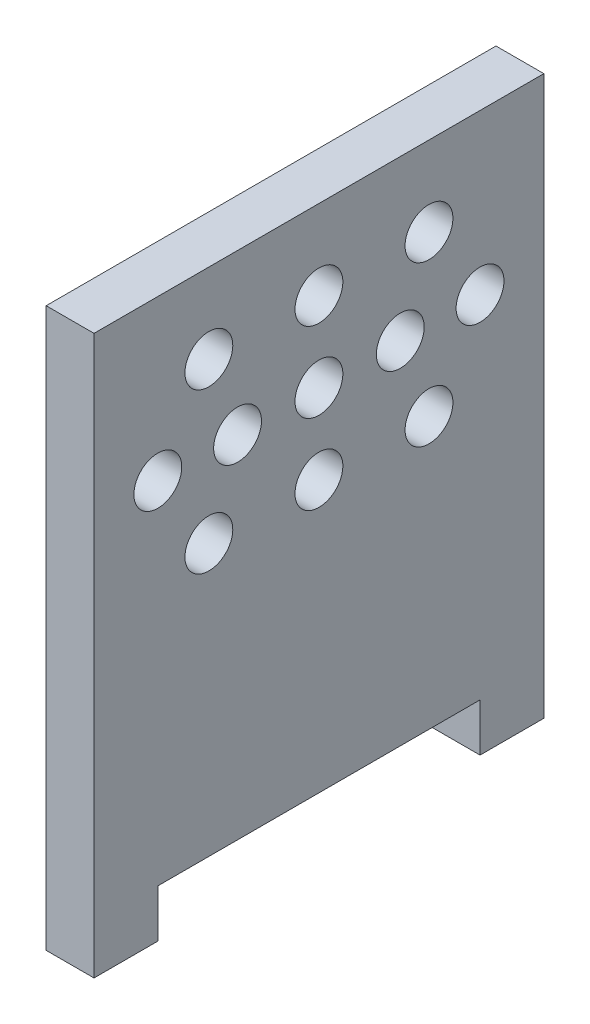
ISO-10303-21;
HEADER;
FILE_DESCRIPTION(('STEP AP214'),'2;1');
FILE_NAME('part.step','',(''),(''),'','','');
FILE_SCHEMA(('AUTOMOTIVE_DESIGN { 1 0 10303 214 1 1 1 1 }'));
ENDSEC;
DATA;
#1=APPLICATION_CONTEXT('core data for automotive mechanical design processes');
#2=APPLICATION_PROTOCOL_DEFINITION('international standard','automotive_design',2000,#1);
#3=PRODUCT_CONTEXT('',#1,'mechanical');
#4=PRODUCT('Part','Part','',(#3));
#5=PRODUCT_RELATED_PRODUCT_CATEGORY('part','',(#4));
#6=PRODUCT_DEFINITION_FORMATION('','',#4);
#7=PRODUCT_DEFINITION_CONTEXT('part definition',#1,'design');
#8=PRODUCT_DEFINITION('design','',#6,#7);
#9=PRODUCT_DEFINITION_SHAPE('','',#8);
#10=(LENGTH_UNIT() NAMED_UNIT(*) SI_UNIT(.MILLI.,.METRE.));
#11=(NAMED_UNIT(*) PLANE_ANGLE_UNIT() SI_UNIT($,.RADIAN.));
#12=(NAMED_UNIT(*) SI_UNIT($,.STERADIAN.) SOLID_ANGLE_UNIT());
#13=UNCERTAINTY_MEASURE_WITH_UNIT(LENGTH_MEASURE(1.E-05),#10,'distance_accuracy_value','');
#14=(GEOMETRIC_REPRESENTATION_CONTEXT(3) GLOBAL_UNCERTAINTY_ASSIGNED_CONTEXT((#13)) GLOBAL_UNIT_ASSIGNED_CONTEXT((#10,
#11,#12)) REPRESENTATION_CONTEXT('',''));
#15=CARTESIAN_POINT('',(0.,0.,0.));
#16=DIRECTION('',(0.,0.,1.));
#17=DIRECTION('',(1.,0.,0.));
#18=AXIS2_PLACEMENT_3D('',#15,#16,#17);
#19=CARTESIAN_POINT('',(0.,-35.,23.2));
#20=DIRECTION('',(0.,-1.,0.));
#21=DIRECTION('',(1.,0.,0.));
#22=AXIS2_PLACEMENT_3D('',#19,#20,#21);
#23=PLANE('',#22);
#24=DIRECTION('',(0.,0.,1.));
#25=VECTOR('',#24,1.);
#26=CARTESIAN_POINT('',(-3.,-35.,23.2));
#27=LINE('',#26,#25);
#28=CARTESIAN_POINT('',(-3.,-35.,23.2));
#29=VERTEX_POINT('',#28);
#30=CARTESIAN_POINT('',(-3.,-35.,27.2));
#31=VERTEX_POINT('',#30);
#32=EDGE_CURVE('E130',#29,#31,#27,.T.);
#33=ORIENTED_EDGE('',*,*,#32,.F.);
#34=DIRECTION('',(-1.,0.,0.));
#35=VECTOR('',#34,1.);
#36=CARTESIAN_POINT('',(0.,-35.,23.2));
#37=LINE('',#36,#35);
#38=CARTESIAN_POINT('',(0.,-35.,23.2));
#39=VERTEX_POINT('',#38);
#40=EDGE_CURVE('E11',#39,#29,#37,.T.);
#41=ORIENTED_EDGE('',*,*,#40,.F.);
#42=DIRECTION('',(0.,0.,1.));
#43=VECTOR('',#42,1.);
#44=CARTESIAN_POINT('',(0.,-35.,23.2));
#45=LINE('',#44,#43);
#46=CARTESIAN_POINT('',(0.,-35.,27.2));
#47=VERTEX_POINT('',#46);
#48=EDGE_CURVE('E151',#39,#47,#45,.T.);
#49=ORIENTED_EDGE('',*,*,#48,.T.);
#50=DIRECTION('',(-1.,0.,0.));
#51=VECTOR('',#50,1.);
#52=CARTESIAN_POINT('',(0.,-35.,27.2));
#53=LINE('',#52,#51);
#54=EDGE_CURVE('E36',#47,#31,#53,.T.);
#55=ORIENTED_EDGE('',*,*,#54,.T.);
#56=EDGE_LOOP('',(#33,#41,#49,#55));
#57=FACE_BOUND('',#56,.T.);
#58=ADVANCED_FACE('F33',(#57),#23,.T.);
#59=CARTESIAN_POINT('',(0.,-32.,23.2));
#60=DIRECTION('',(0.,0.,-1.));
#61=DIRECTION('',(-1.,0.,0.));
#62=AXIS2_PLACEMENT_3D('',#59,#60,#61);
#63=PLANE('',#62);
#64=DIRECTION('',(0.,-1.,0.));
#65=VECTOR('',#64,1.);
#66=CARTESIAN_POINT('',(-3.,-32.,23.2));
#67=LINE('',#66,#65);
#68=CARTESIAN_POINT('',(-3.,-32.,23.2));
#69=VERTEX_POINT('',#68);
#70=EDGE_CURVE('E149',#69,#29,#67,.T.);
#71=ORIENTED_EDGE('',*,*,#70,.F.);
#72=DIRECTION('',(-1.,0.,0.));
#73=VECTOR('',#72,1.);
#74=CARTESIAN_POINT('',(0.,-32.,23.2));
#75=LINE('',#74,#73);
#76=CARTESIAN_POINT('',(0.,-32.,23.2));
#77=VERTEX_POINT('',#76);
#78=EDGE_CURVE('E42',#77,#69,#75,.T.);
#79=ORIENTED_EDGE('',*,*,#78,.F.);
#80=DIRECTION('',(0.,-1.,0.));
#81=VECTOR('',#80,1.);
#82=CARTESIAN_POINT('',(0.,-32.,23.2));
#83=LINE('',#82,#81);
#84=EDGE_CURVE('E120',#77,#39,#83,.T.);
#85=ORIENTED_EDGE('',*,*,#84,.T.);
#86=ORIENTED_EDGE('',*,*,#40,.T.);
#87=EDGE_LOOP('',(#71,#79,#85,#86));
#88=FACE_BOUND('',#87,.T.);
#89=ADVANCED_FACE('F163',(#88),#63,.T.);
#90=CARTESIAN_POINT('',(0.,-32.,2.99999999999999));
#91=DIRECTION('',(0.,-1.,0.));
#92=DIRECTION('',(0.,0.,-1.));
#93=AXIS2_PLACEMENT_3D('',#90,#91,#92);
#94=PLANE('',#93);
#95=DIRECTION('',(0.,0.,1.));
#96=VECTOR('',#95,1.);
#97=CARTESIAN_POINT('',(-3.,-32.,2.99999999999999));
#98=LINE('',#97,#96);
#99=CARTESIAN_POINT('',(-3.,-32.,2.99999999999999));
#100=VERTEX_POINT('',#99);
#101=EDGE_CURVE('E107',#100,#69,#98,.T.);
#102=ORIENTED_EDGE('',*,*,#101,.F.);
#103=DIRECTION('',(-1.,0.,0.));
#104=VECTOR('',#103,1.);
#105=CARTESIAN_POINT('',(0.,-32.,2.99999999999999));
#106=LINE('',#105,#104);
#107=CARTESIAN_POINT('',(0.,-32.,2.99999999999999));
#108=VERTEX_POINT('',#107);
#109=EDGE_CURVE('E102',#108,#100,#106,.T.);
#110=ORIENTED_EDGE('',*,*,#109,.F.);
#111=DIRECTION('',(0.,0.,1.));
#112=VECTOR('',#111,1.);
#113=CARTESIAN_POINT('',(0.,-32.,2.99999999999999));
#114=LINE('',#113,#112);
#115=EDGE_CURVE('E105',#108,#77,#114,.T.);
#116=ORIENTED_EDGE('',*,*,#115,.T.);
#117=ORIENTED_EDGE('',*,*,#78,.T.);
#118=EDGE_LOOP('',(#102,#110,#116,#117));
#119=FACE_BOUND('',#118,.T.);
#120=ADVANCED_FACE('F104',(#119),#94,.T.);
#121=CARTESIAN_POINT('',(0.,-35.,3.));
#122=DIRECTION('',(0.,0.,1.));
#123=DIRECTION('',(0.,-1.,0.));
#124=AXIS2_PLACEMENT_3D('',#121,#122,#123);
#125=PLANE('',#124);
#126=DIRECTION('',(0.,1.,0.));
#127=VECTOR('',#126,1.);
#128=CARTESIAN_POINT('',(-3.,-35.,3.));
#129=LINE('',#128,#127);
#130=CARTESIAN_POINT('',(-3.,-35.,3.));
#131=VERTEX_POINT('',#130);
#132=EDGE_CURVE('E146',#131,#100,#129,.T.);
#133=ORIENTED_EDGE('',*,*,#132,.F.);
#134=DIRECTION('',(-1.,0.,0.));
#135=VECTOR('',#134,1.);
#136=CARTESIAN_POINT('',(0.,-35.,3.));
#137=LINE('',#136,#135);
#138=CARTESIAN_POINT('',(0.,-35.,3.));
#139=VERTEX_POINT('',#138);
#140=EDGE_CURVE('E112',#139,#131,#137,.T.);
#141=ORIENTED_EDGE('',*,*,#140,.F.);
#142=DIRECTION('',(0.,1.,0.));
#143=VECTOR('',#142,1.);
#144=CARTESIAN_POINT('',(0.,-35.,3.));
#145=LINE('',#144,#143);
#146=EDGE_CURVE('E118',#139,#108,#145,.T.);
#147=ORIENTED_EDGE('',*,*,#146,.T.);
#148=ORIENTED_EDGE('',*,*,#109,.T.);
#149=EDGE_LOOP('',(#133,#141,#147,#148));
#150=FACE_BOUND('',#149,.T.);
#151=ADVANCED_FACE('F122',(#150),#125,.T.);
#152=CARTESIAN_POINT('',(0.,-35.,-1.00000000000001));
#153=DIRECTION('',(0.,-1.,0.));
#154=DIRECTION('',(0.,0.,-1.));
#155=AXIS2_PLACEMENT_3D('',#152,#153,#154);
#156=PLANE('',#155);
#157=DIRECTION('',(0.,0.,1.));
#158=VECTOR('',#157,1.);
#159=CARTESIAN_POINT('',(-3.,-35.,-1.00000000000001));
#160=LINE('',#159,#158);
#161=CARTESIAN_POINT('',(-3.,-35.,-1.00000000000001));
#162=VERTEX_POINT('',#161);
#163=EDGE_CURVE('E143',#162,#131,#160,.T.);
#164=ORIENTED_EDGE('',*,*,#163,.F.);
#165=DIRECTION('',(-1.,0.,0.));
#166=VECTOR('',#165,1.);
#167=CARTESIAN_POINT('',(0.,-35.,-1.00000000000001));
#168=LINE('',#167,#166);
#169=CARTESIAN_POINT('',(0.,-35.,-1.00000000000001));
#170=VERTEX_POINT('',#169);
#171=EDGE_CURVE('E155',#170,#162,#168,.T.);
#172=ORIENTED_EDGE('',*,*,#171,.F.);
#173=DIRECTION('',(0.,0.,1.));
#174=VECTOR('',#173,1.);
#175=CARTESIAN_POINT('',(0.,-35.,-1.00000000000001));
#176=LINE('',#175,#174);
#177=EDGE_CURVE('E123',#170,#139,#176,.T.);
#178=ORIENTED_EDGE('',*,*,#177,.T.);
#179=ORIENTED_EDGE('',*,*,#140,.T.);
#180=EDGE_LOOP('',(#164,#172,#178,#179));
#181=FACE_BOUND('',#180,.T.);
#182=ADVANCED_FACE('F176',(#181),#156,.T.);
#183=CARTESIAN_POINT('',(0.,0.,-1.00000000000001));
#184=DIRECTION('',(0.,0.,-1.));
#185=DIRECTION('',(-1.,0.,0.));
#186=AXIS2_PLACEMENT_3D('',#183,#184,#185);
#187=PLANE('',#186);
#188=DIRECTION('',(0.,-1.,0.));
#189=VECTOR('',#188,1.);
#190=CARTESIAN_POINT('',(-3.,0.,-1.00000000000001));
#191=LINE('',#190,#189);
#192=CARTESIAN_POINT('',(-3.,0.,-1.00000000000001));
#193=VERTEX_POINT('',#192);
#194=EDGE_CURVE('E140',#193,#162,#191,.T.);
#195=ORIENTED_EDGE('',*,*,#194,.F.);
#196=DIRECTION('',(-1.,0.,0.));
#197=VECTOR('',#196,1.);
#198=CARTESIAN_POINT('',(0.,0.,-1.00000000000001));
#199=LINE('',#198,#197);
#200=CARTESIAN_POINT('',(0.,0.,-1.00000000000001));
#201=VERTEX_POINT('',#200);
#202=EDGE_CURVE('E157',#201,#193,#199,.T.);
#203=ORIENTED_EDGE('',*,*,#202,.F.);
#204=DIRECTION('',(0.,-1.,0.));
#205=VECTOR('',#204,1.);
#206=CARTESIAN_POINT('',(0.,0.,-1.00000000000001));
#207=LINE('',#206,#205);
#208=EDGE_CURVE('E125',#201,#170,#207,.T.);
#209=ORIENTED_EDGE('',*,*,#208,.T.);
#210=ORIENTED_EDGE('',*,*,#171,.T.);
#211=EDGE_LOOP('',(#195,#203,#209,#210));
#212=FACE_BOUND('',#211,.T.);
#213=ADVANCED_FACE('F179',(#212),#187,.T.);
#214=CARTESIAN_POINT('',(0.,0.,27.2));
#215=DIRECTION('',(0.,1.,0.));
#216=DIRECTION('',(0.,0.,1.));
#217=AXIS2_PLACEMENT_3D('',#214,#215,#216);
#218=PLANE('',#217);
#219=DIRECTION('',(0.,0.,-1.));
#220=VECTOR('',#219,1.);
#221=CARTESIAN_POINT('',(-3.,0.,27.2));
#222=LINE('',#221,#220);
#223=CARTESIAN_POINT('',(-3.,0.,27.2));
#224=VERTEX_POINT('',#223);
#225=EDGE_CURVE('E137',#224,#193,#222,.T.);
#226=ORIENTED_EDGE('',*,*,#225,.F.);
#227=DIRECTION('',(-1.,0.,0.));
#228=VECTOR('',#227,1.);
#229=CARTESIAN_POINT('',(0.,0.,27.2));
#230=LINE('',#229,#228);
#231=CARTESIAN_POINT('',(0.,0.,27.2));
#232=VERTEX_POINT('',#231);
#233=EDGE_CURVE('E158',#232,#224,#230,.T.);
#234=ORIENTED_EDGE('',*,*,#233,.F.);
#235=DIRECTION('',(0.,0.,-1.));
#236=VECTOR('',#235,1.);
#237=CARTESIAN_POINT('',(0.,0.,27.2));
#238=LINE('',#237,#236);
#239=EDGE_CURVE('E315',#232,#201,#238,.T.);
#240=ORIENTED_EDGE('',*,*,#239,.T.);
#241=ORIENTED_EDGE('',*,*,#202,.T.);
#242=EDGE_LOOP('',(#226,#234,#240,#241));
#243=FACE_BOUND('',#242,.T.);
#244=ADVANCED_FACE('F183',(#243),#218,.T.);
#245=CARTESIAN_POINT('',(0.,-35.,27.2));
#246=DIRECTION('',(0.,0.,1.));
#247=DIRECTION('',(0.,-1.,0.));
#248=AXIS2_PLACEMENT_3D('',#245,#246,#247);
#249=PLANE('',#248);
#250=DIRECTION('',(0.,1.,0.));
#251=VECTOR('',#250,1.);
#252=CARTESIAN_POINT('',(-3.,-35.,27.2));
#253=LINE('',#252,#251);
#254=EDGE_CURVE('E133',#31,#224,#253,.T.);
#255=ORIENTED_EDGE('',*,*,#254,.F.);
#256=ORIENTED_EDGE('',*,*,#54,.F.);
#257=DIRECTION('',(0.,1.,0.));
#258=VECTOR('',#257,1.);
#259=CARTESIAN_POINT('',(0.,-35.,27.2));
#260=LINE('',#259,#258);
#261=EDGE_CURVE('E313',#47,#232,#260,.T.);
#262=ORIENTED_EDGE('',*,*,#261,.T.);
#263=ORIENTED_EDGE('',*,*,#233,.T.);
#264=EDGE_LOOP('',(#255,#256,#262,#263));
#265=FACE_BOUND('',#264,.T.);
#266=ADVANCED_FACE('F160',(#265),#249,.T.);
#267=CARTESIAN_POINT('',(0.,0.,0.));
#268=DIRECTION('',(-1.,0.,0.));
#269=DIRECTION('',(0.,-1.,0.));
#270=AXIS2_PLACEMENT_3D('',#267,#268,#269);
#271=PLANE('',#270);
#272=CARTESIAN_POINT('',(0.,-9.99998284033426,18.1999999999711));
#273=DIRECTION('',(-1.,0.,0.));
#274=DIRECTION('',(0.,1.,0.));
#275=AXIS2_PLACEMENT_3D('',#272,#273,#274);
#276=CIRCLE('',#275,1.50000000000828);
#277=CARTESIAN_POINT('',(0.,-8.49998284032598,18.1999999999711));
#278=VERTEX_POINT('',#277);
#279=EDGE_CURVE('E246',#278,#278,#276,.T.);
#280=ORIENTED_EDGE('',*,*,#279,.T.);
#281=EDGE_LOOP('',(#280));
#282=FACE_BOUND('',#281,.T.);
#283=CARTESIAN_POINT('',(0.,-9.99998284033426,23.2));
#284=DIRECTION('',(-1.,0.,0.));
#285=DIRECTION('',(0.,1.,0.));
#286=AXIS2_PLACEMENT_3D('',#283,#284,#285);
#287=CIRCLE('',#286,1.5);
#288=CARTESIAN_POINT('',(0.,-8.49998284033425,23.2));
#289=VERTEX_POINT('',#288);
#290=EDGE_CURVE('E254',#289,#289,#287,.T.);
#291=ORIENTED_EDGE('',*,*,#290,.T.);
#292=EDGE_LOOP('',(#291));
#293=FACE_BOUND('',#292,.T.);
#294=CARTESIAN_POINT('',(0.,-15.,13.1));
#295=DIRECTION('',(-1.,0.,0.));
#296=DIRECTION('',(0.,1.,0.));
#297=AXIS2_PLACEMENT_3D('',#294,#295,#296);
#298=CIRCLE('',#297,1.5);
#299=CARTESIAN_POINT('',(0.,-13.5,13.1));
#300=VERTEX_POINT('',#299);
#301=EDGE_CURVE('E260',#300,#300,#298,.T.);
#302=ORIENTED_EDGE('',*,*,#301,.T.);
#303=EDGE_LOOP('',(#302));
#304=FACE_BOUND('',#303,.T.);
#305=CARTESIAN_POINT('',(0.,-5.,13.1));
#306=DIRECTION('',(-1.,0.,0.));
#307=DIRECTION('',(0.,1.,0.));
#308=AXIS2_PLACEMENT_3D('',#305,#306,#307);
#309=CIRCLE('',#308,1.5);
#310=CARTESIAN_POINT('',(0.,-3.5,13.1));
#311=VERTEX_POINT('',#310);
#312=EDGE_CURVE('E266',#311,#311,#309,.T.);
#313=ORIENTED_EDGE('',*,*,#312,.T.);
#314=EDGE_LOOP('',(#313));
#315=FACE_BOUND('',#314,.T.);
#316=CARTESIAN_POINT('',(0.,-10.,2.99999999999999));
#317=DIRECTION('',(-1.,0.,0.));
#318=DIRECTION('',(0.,1.,0.));
#319=AXIS2_PLACEMENT_3D('',#316,#317,#318);
#320=CIRCLE('',#319,1.5);
#321=CARTESIAN_POINT('',(0.,-8.5,2.99999999999999));
#322=VERTEX_POINT('',#321);
#323=EDGE_CURVE('E272',#322,#322,#320,.T.);
#324=ORIENTED_EDGE('',*,*,#323,.T.);
#325=EDGE_LOOP('',(#324));
#326=FACE_BOUND('',#325,.T.);
#327=CARTESIAN_POINT('',(0.,-10.,13.1));
#328=DIRECTION('',(-1.,0.,0.));
#329=DIRECTION('',(0.,1.,0.));
#330=AXIS2_PLACEMENT_3D('',#327,#328,#329);
#331=CIRCLE('',#330,1.5);
#332=CARTESIAN_POINT('',(0.,-8.5,13.1));
#333=VERTEX_POINT('',#332);
#334=EDGE_CURVE('E278',#333,#333,#331,.T.);
#335=ORIENTED_EDGE('',*,*,#334,.T.);
#336=EDGE_LOOP('',(#335));
#337=FACE_BOUND('',#336,.T.);
#338=CARTESIAN_POINT('',(0.,-15.,6.2));
#339=DIRECTION('',(-1.,0.,0.));
#340=DIRECTION('',(0.,1.,0.));
#341=AXIS2_PLACEMENT_3D('',#338,#339,#340);
#342=CIRCLE('',#341,1.5);
#343=CARTESIAN_POINT('',(0.,-13.5,6.2));
#344=VERTEX_POINT('',#343);
#345=EDGE_CURVE('E284',#344,#344,#342,.T.);
#346=ORIENTED_EDGE('',*,*,#345,.T.);
#347=EDGE_LOOP('',(#346));
#348=FACE_BOUND('',#347,.T.);
#349=CARTESIAN_POINT('',(0.,-5.,20.));
#350=DIRECTION('',(-1.,0.,0.));
#351=DIRECTION('',(0.,1.,0.));
#352=AXIS2_PLACEMENT_3D('',#349,#350,#351);
#353=CIRCLE('',#352,1.5);
#354=CARTESIAN_POINT('',(0.,-3.5,20.));
#355=VERTEX_POINT('',#354);
#356=EDGE_CURVE('E290',#355,#355,#353,.T.);
#357=ORIENTED_EDGE('',*,*,#356,.T.);
#358=EDGE_LOOP('',(#357));
#359=FACE_BOUND('',#358,.T.);
#360=CARTESIAN_POINT('',(0.,-15.,20.));
#361=DIRECTION('',(-1.,0.,0.));
#362=DIRECTION('',(0.,1.,0.));
#363=AXIS2_PLACEMENT_3D('',#360,#361,#362);
#364=CIRCLE('',#363,1.5);
#365=CARTESIAN_POINT('',(0.,-13.5,20.));
#366=VERTEX_POINT('',#365);
#367=EDGE_CURVE('E296',#366,#366,#364,.T.);
#368=ORIENTED_EDGE('',*,*,#367,.T.);
#369=EDGE_LOOP('',(#368));
#370=FACE_BOUND('',#369,.T.);
#371=CARTESIAN_POINT('',(0.,-10.,7.99999999999999));
#372=DIRECTION('',(-1.,0.,0.));
#373=DIRECTION('',(0.,1.,0.));
#374=AXIS2_PLACEMENT_3D('',#371,#372,#373);
#375=CIRCLE('',#374,1.5);
#376=CARTESIAN_POINT('',(0.,-8.5,7.99999999999999));
#377=VERTEX_POINT('',#376);
#378=EDGE_CURVE('E302',#377,#377,#375,.T.);
#379=ORIENTED_EDGE('',*,*,#378,.T.);
#380=EDGE_LOOP('',(#379));
#381=FACE_BOUND('',#380,.T.);
#382=CARTESIAN_POINT('',(0.,-5.,6.2));
#383=DIRECTION('',(-1.,0.,0.));
#384=DIRECTION('',(0.,1.,0.));
#385=AXIS2_PLACEMENT_3D('',#382,#383,#384);
#386=CIRCLE('',#385,1.5);
#387=CARTESIAN_POINT('',(0.,-3.5,6.2));
#388=VERTEX_POINT('',#387);
#389=EDGE_CURVE('E134',#388,#388,#386,.T.);
#390=ORIENTED_EDGE('',*,*,#389,.T.);
#391=EDGE_LOOP('',(#390));
#392=FACE_BOUND('',#391,.T.);
#393=ORIENTED_EDGE('',*,*,#48,.F.);
#394=ORIENTED_EDGE('',*,*,#84,.F.);
#395=ORIENTED_EDGE('',*,*,#115,.F.);
#396=ORIENTED_EDGE('',*,*,#146,.F.);
#397=ORIENTED_EDGE('',*,*,#177,.F.);
#398=ORIENTED_EDGE('',*,*,#208,.F.);
#399=ORIENTED_EDGE('',*,*,#239,.F.);
#400=ORIENTED_EDGE('',*,*,#261,.F.);
#401=EDGE_LOOP('',(#393,#394,#395,#396,#397,#398,#399,#400));
#402=FACE_BOUND('',#401,.T.);
#403=ADVANCED_FACE('F116',(#282,#293,#304,#315,#326,#337,#348,#359,#370,#381,#392,#402),#271,.F.);
#404=CARTESIAN_POINT('',(-3.,0.,0.));
#405=DIRECTION('',(-1.,0.,0.));
#406=DIRECTION('',(0.,-1.,0.));
#407=AXIS2_PLACEMENT_3D('',#404,#405,#406);
#408=PLANE('',#407);
#409=CARTESIAN_POINT('',(-3.,-9.99998284033426,18.1999999999711));
#410=DIRECTION('',(-1.,0.,0.));
#411=DIRECTION('',(0.,1.,0.));
#412=AXIS2_PLACEMENT_3D('',#409,#410,#411);
#413=CIRCLE('',#412,1.50000000000828);
#414=CARTESIAN_POINT('',(-3.,-8.49998284032598,18.1999999999711));
#415=VERTEX_POINT('',#414);
#416=EDGE_CURVE('E249',#415,#415,#413,.T.);
#417=ORIENTED_EDGE('',*,*,#416,.F.);
#418=EDGE_LOOP('',(#417));
#419=FACE_BOUND('',#418,.T.);
#420=CARTESIAN_POINT('',(-3.,-9.99998284033426,23.2));
#421=DIRECTION('',(-1.,0.,0.));
#422=DIRECTION('',(0.,1.,0.));
#423=AXIS2_PLACEMENT_3D('',#420,#421,#422);
#424=CIRCLE('',#423,1.5);
#425=CARTESIAN_POINT('',(-3.,-8.49998284033425,23.2));
#426=VERTEX_POINT('',#425);
#427=EDGE_CURVE('E251',#426,#426,#424,.T.);
#428=ORIENTED_EDGE('',*,*,#427,.F.);
#429=EDGE_LOOP('',(#428));
#430=FACE_BOUND('',#429,.T.);
#431=CARTESIAN_POINT('',(-3.,-15.,13.1));
#432=DIRECTION('',(-1.,0.,0.));
#433=DIRECTION('',(0.,1.,0.));
#434=AXIS2_PLACEMENT_3D('',#431,#432,#433);
#435=CIRCLE('',#434,1.5);
#436=CARTESIAN_POINT('',(-3.,-13.5,13.1));
#437=VERTEX_POINT('',#436);
#438=EDGE_CURVE('E257',#437,#437,#435,.T.);
#439=ORIENTED_EDGE('',*,*,#438,.F.);
#440=EDGE_LOOP('',(#439));
#441=FACE_BOUND('',#440,.T.);
#442=CARTESIAN_POINT('',(-3.,-5.,13.1));
#443=DIRECTION('',(-1.,0.,0.));
#444=DIRECTION('',(0.,1.,0.));
#445=AXIS2_PLACEMENT_3D('',#442,#443,#444);
#446=CIRCLE('',#445,1.5);
#447=CARTESIAN_POINT('',(-3.,-3.5,13.1));
#448=VERTEX_POINT('',#447);
#449=EDGE_CURVE('E263',#448,#448,#446,.T.);
#450=ORIENTED_EDGE('',*,*,#449,.F.);
#451=EDGE_LOOP('',(#450));
#452=FACE_BOUND('',#451,.T.);
#453=CARTESIAN_POINT('',(-3.,-10.,2.99999999999999));
#454=DIRECTION('',(-1.,0.,0.));
#455=DIRECTION('',(0.,1.,0.));
#456=AXIS2_PLACEMENT_3D('',#453,#454,#455);
#457=CIRCLE('',#456,1.5);
#458=CARTESIAN_POINT('',(-3.,-8.5,2.99999999999999));
#459=VERTEX_POINT('',#458);
#460=EDGE_CURVE('E269',#459,#459,#457,.T.);
#461=ORIENTED_EDGE('',*,*,#460,.F.);
#462=EDGE_LOOP('',(#461));
#463=FACE_BOUND('',#462,.T.);
#464=CARTESIAN_POINT('',(-3.,-10.,13.1));
#465=DIRECTION('',(-1.,0.,0.));
#466=DIRECTION('',(0.,1.,0.));
#467=AXIS2_PLACEMENT_3D('',#464,#465,#466);
#468=CIRCLE('',#467,1.5);
#469=CARTESIAN_POINT('',(-3.,-8.5,13.1));
#470=VERTEX_POINT('',#469);
#471=EDGE_CURVE('E275',#470,#470,#468,.T.);
#472=ORIENTED_EDGE('',*,*,#471,.F.);
#473=EDGE_LOOP('',(#472));
#474=FACE_BOUND('',#473,.T.);
#475=CARTESIAN_POINT('',(-3.,-15.,6.2));
#476=DIRECTION('',(-1.,0.,0.));
#477=DIRECTION('',(0.,1.,0.));
#478=AXIS2_PLACEMENT_3D('',#475,#476,#477);
#479=CIRCLE('',#478,1.5);
#480=CARTESIAN_POINT('',(-3.,-13.5,6.2));
#481=VERTEX_POINT('',#480);
#482=EDGE_CURVE('E281',#481,#481,#479,.T.);
#483=ORIENTED_EDGE('',*,*,#482,.F.);
#484=EDGE_LOOP('',(#483));
#485=FACE_BOUND('',#484,.T.);
#486=CARTESIAN_POINT('',(-3.,-5.,20.));
#487=DIRECTION('',(-1.,0.,0.));
#488=DIRECTION('',(0.,1.,0.));
#489=AXIS2_PLACEMENT_3D('',#486,#487,#488);
#490=CIRCLE('',#489,1.5);
#491=CARTESIAN_POINT('',(-3.,-3.5,20.));
#492=VERTEX_POINT('',#491);
#493=EDGE_CURVE('E287',#492,#492,#490,.T.);
#494=ORIENTED_EDGE('',*,*,#493,.F.);
#495=EDGE_LOOP('',(#494));
#496=FACE_BOUND('',#495,.T.);
#497=CARTESIAN_POINT('',(-3.,-15.,20.));
#498=DIRECTION('',(-1.,0.,0.));
#499=DIRECTION('',(0.,1.,0.));
#500=AXIS2_PLACEMENT_3D('',#497,#498,#499);
#501=CIRCLE('',#500,1.5);
#502=CARTESIAN_POINT('',(-3.,-13.5,20.));
#503=VERTEX_POINT('',#502);
#504=EDGE_CURVE('E293',#503,#503,#501,.T.);
#505=ORIENTED_EDGE('',*,*,#504,.F.);
#506=EDGE_LOOP('',(#505));
#507=FACE_BOUND('',#506,.T.);
#508=CARTESIAN_POINT('',(-3.,-10.,7.99999999999999));
#509=DIRECTION('',(-1.,0.,0.));
#510=DIRECTION('',(0.,1.,0.));
#511=AXIS2_PLACEMENT_3D('',#508,#509,#510);
#512=CIRCLE('',#511,1.5);
#513=CARTESIAN_POINT('',(-3.,-8.5,7.99999999999999));
#514=VERTEX_POINT('',#513);
#515=EDGE_CURVE('E299',#514,#514,#512,.T.);
#516=ORIENTED_EDGE('',*,*,#515,.F.);
#517=EDGE_LOOP('',(#516));
#518=FACE_BOUND('',#517,.T.);
#519=CARTESIAN_POINT('',(-3.,-5.,6.2));
#520=DIRECTION('',(-1.,0.,0.));
#521=DIRECTION('',(0.,1.,0.));
#522=AXIS2_PLACEMENT_3D('',#519,#520,#521);
#523=CIRCLE('',#522,1.5);
#524=CARTESIAN_POINT('',(-3.,-3.5,6.2));
#525=VERTEX_POINT('',#524);
#526=EDGE_CURVE('E305',#525,#525,#523,.T.);
#527=ORIENTED_EDGE('',*,*,#526,.F.);
#528=EDGE_LOOP('',(#527));
#529=FACE_BOUND('',#528,.T.);
#530=ORIENTED_EDGE('',*,*,#32,.T.);
#531=ORIENTED_EDGE('',*,*,#254,.T.);
#532=ORIENTED_EDGE('',*,*,#225,.T.);
#533=ORIENTED_EDGE('',*,*,#194,.T.);
#534=ORIENTED_EDGE('',*,*,#163,.T.);
#535=ORIENTED_EDGE('',*,*,#132,.T.);
#536=ORIENTED_EDGE('',*,*,#101,.T.);
#537=ORIENTED_EDGE('',*,*,#70,.T.);
#538=EDGE_LOOP('',(#530,#531,#532,#533,#534,#535,#536,#537));
#539=FACE_BOUND('',#538,.T.);
#540=ADVANCED_FACE('F162',(#419,#430,#441,#452,#463,#474,#485,#496,#507,#518,#529,#539),#408,.T.);
#541=CARTESIAN_POINT('',(0.,-5.,6.2));
#542=DIRECTION('',(-1.,0.,0.));
#543=DIRECTION('',(0.,-1.,0.));
#544=AXIS2_PLACEMENT_3D('',#541,#542,#543);
#545=CYLINDRICAL_SURFACE('',#544,1.5);
#546=ORIENTED_EDGE('',*,*,#389,.F.);
#547=EDGE_LOOP('',(#546));
#548=FACE_BOUND('',#547,.T.);
#549=ORIENTED_EDGE('',*,*,#526,.T.);
#550=EDGE_LOOP('',(#549));
#551=FACE_BOUND('',#550,.T.);
#552=ADVANCED_FACE('F195',(#548,#551),#545,.F.);
#553=CARTESIAN_POINT('',(0.,-10.,7.99999999999999));
#554=DIRECTION('',(-1.,0.,0.));
#555=DIRECTION('',(0.,-1.,0.));
#556=AXIS2_PLACEMENT_3D('',#553,#554,#555);
#557=CYLINDRICAL_SURFACE('',#556,1.5);
#558=ORIENTED_EDGE('',*,*,#378,.F.);
#559=EDGE_LOOP('',(#558));
#560=FACE_BOUND('',#559,.T.);
#561=ORIENTED_EDGE('',*,*,#515,.T.);
#562=EDGE_LOOP('',(#561));
#563=FACE_BOUND('',#562,.T.);
#564=ADVANCED_FACE('F202',(#560,#563),#557,.F.);
#565=CARTESIAN_POINT('',(0.,-15.,20.));
#566=DIRECTION('',(-1.,0.,0.));
#567=DIRECTION('',(0.,-1.,0.));
#568=AXIS2_PLACEMENT_3D('',#565,#566,#567);
#569=CYLINDRICAL_SURFACE('',#568,1.5);
#570=ORIENTED_EDGE('',*,*,#367,.F.);
#571=EDGE_LOOP('',(#570));
#572=FACE_BOUND('',#571,.T.);
#573=ORIENTED_EDGE('',*,*,#504,.T.);
#574=EDGE_LOOP('',(#573));
#575=FACE_BOUND('',#574,.T.);
#576=ADVANCED_FACE('F206',(#572,#575),#569,.F.);
#577=CARTESIAN_POINT('',(0.,-5.,20.));
#578=DIRECTION('',(-1.,0.,0.));
#579=DIRECTION('',(0.,-1.,0.));
#580=AXIS2_PLACEMENT_3D('',#577,#578,#579);
#581=CYLINDRICAL_SURFACE('',#580,1.5);
#582=ORIENTED_EDGE('',*,*,#356,.F.);
#583=EDGE_LOOP('',(#582));
#584=FACE_BOUND('',#583,.T.);
#585=ORIENTED_EDGE('',*,*,#493,.T.);
#586=EDGE_LOOP('',(#585));
#587=FACE_BOUND('',#586,.T.);
#588=ADVANCED_FACE('F210',(#584,#587),#581,.F.);
#589=CARTESIAN_POINT('',(0.,-15.,6.2));
#590=DIRECTION('',(-1.,0.,0.));
#591=DIRECTION('',(0.,-1.,0.));
#592=AXIS2_PLACEMENT_3D('',#589,#590,#591);
#593=CYLINDRICAL_SURFACE('',#592,1.5);
#594=ORIENTED_EDGE('',*,*,#345,.F.);
#595=EDGE_LOOP('',(#594));
#596=FACE_BOUND('',#595,.T.);
#597=ORIENTED_EDGE('',*,*,#482,.T.);
#598=EDGE_LOOP('',(#597));
#599=FACE_BOUND('',#598,.T.);
#600=ADVANCED_FACE('F214',(#596,#599),#593,.F.);
#601=CARTESIAN_POINT('',(0.,-10.,13.1));
#602=DIRECTION('',(-1.,0.,0.));
#603=DIRECTION('',(0.,-1.,0.));
#604=AXIS2_PLACEMENT_3D('',#601,#602,#603);
#605=CYLINDRICAL_SURFACE('',#604,1.5);
#606=ORIENTED_EDGE('',*,*,#334,.F.);
#607=EDGE_LOOP('',(#606));
#608=FACE_BOUND('',#607,.T.);
#609=ORIENTED_EDGE('',*,*,#471,.T.);
#610=EDGE_LOOP('',(#609));
#611=FACE_BOUND('',#610,.T.);
#612=ADVANCED_FACE('F218',(#608,#611),#605,.F.);
#613=CARTESIAN_POINT('',(0.,-10.,2.99999999999999));
#614=DIRECTION('',(-1.,0.,0.));
#615=DIRECTION('',(0.,-1.,0.));
#616=AXIS2_PLACEMENT_3D('',#613,#614,#615);
#617=CYLINDRICAL_SURFACE('',#616,1.5);
#618=ORIENTED_EDGE('',*,*,#323,.F.);
#619=EDGE_LOOP('',(#618));
#620=FACE_BOUND('',#619,.T.);
#621=ORIENTED_EDGE('',*,*,#460,.T.);
#622=EDGE_LOOP('',(#621));
#623=FACE_BOUND('',#622,.T.);
#624=ADVANCED_FACE('F222',(#620,#623),#617,.F.);
#625=CARTESIAN_POINT('',(0.,-5.,13.1));
#626=DIRECTION('',(-1.,0.,0.));
#627=DIRECTION('',(0.,-1.,0.));
#628=AXIS2_PLACEMENT_3D('',#625,#626,#627);
#629=CYLINDRICAL_SURFACE('',#628,1.5);
#630=ORIENTED_EDGE('',*,*,#312,.F.);
#631=EDGE_LOOP('',(#630));
#632=FACE_BOUND('',#631,.T.);
#633=ORIENTED_EDGE('',*,*,#449,.T.);
#634=EDGE_LOOP('',(#633));
#635=FACE_BOUND('',#634,.T.);
#636=ADVANCED_FACE('F226',(#632,#635),#629,.F.);
#637=CARTESIAN_POINT('',(0.,-15.,13.1));
#638=DIRECTION('',(-1.,0.,0.));
#639=DIRECTION('',(0.,-1.,0.));
#640=AXIS2_PLACEMENT_3D('',#637,#638,#639);
#641=CYLINDRICAL_SURFACE('',#640,1.5);
#642=ORIENTED_EDGE('',*,*,#301,.F.);
#643=EDGE_LOOP('',(#642));
#644=FACE_BOUND('',#643,.T.);
#645=ORIENTED_EDGE('',*,*,#438,.T.);
#646=EDGE_LOOP('',(#645));
#647=FACE_BOUND('',#646,.T.);
#648=ADVANCED_FACE('F230',(#644,#647),#641,.F.);
#649=CARTESIAN_POINT('',(0.,-9.99998284033426,23.2));
#650=DIRECTION('',(-1.,0.,0.));
#651=DIRECTION('',(0.,-1.,0.));
#652=AXIS2_PLACEMENT_3D('',#649,#650,#651);
#653=CYLINDRICAL_SURFACE('',#652,1.5);
#654=ORIENTED_EDGE('',*,*,#290,.F.);
#655=EDGE_LOOP('',(#654));
#656=FACE_BOUND('',#655,.T.);
#657=ORIENTED_EDGE('',*,*,#427,.T.);
#658=EDGE_LOOP('',(#657));
#659=FACE_BOUND('',#658,.T.);
#660=ADVANCED_FACE('F234',(#656,#659),#653,.F.);
#661=CARTESIAN_POINT('',(0.,-9.99998284033426,18.1999999999711));
#662=DIRECTION('',(-1.,0.,0.));
#663=DIRECTION('',(0.,-1.,0.));
#664=AXIS2_PLACEMENT_3D('',#661,#662,#663);
#665=CYLINDRICAL_SURFACE('',#664,1.50000000000828);
#666=ORIENTED_EDGE('',*,*,#279,.F.);
#667=EDGE_LOOP('',(#666));
#668=FACE_BOUND('',#667,.T.);
#669=ORIENTED_EDGE('',*,*,#416,.T.);
#670=EDGE_LOOP('',(#669));
#671=FACE_BOUND('',#670,.T.);
#672=ADVANCED_FACE('F238',(#668,#671),#665,.F.);
#673=CLOSED_SHELL('',(#58,#89,#120,#151,#182,#213,#244,#266,#403,#540,#552,#564,#576,#588,#600,
#612,#624,#636,#648,#660,#672));
#674=MANIFOLD_SOLID_BREP('B2',#673);
#675=ADVANCED_BREP_SHAPE_REPRESENTATION('',(#18,#674),#14);
#676=SHAPE_DEFINITION_REPRESENTATION(#9,#675);
ENDSEC;
END-ISO-10303-21;
